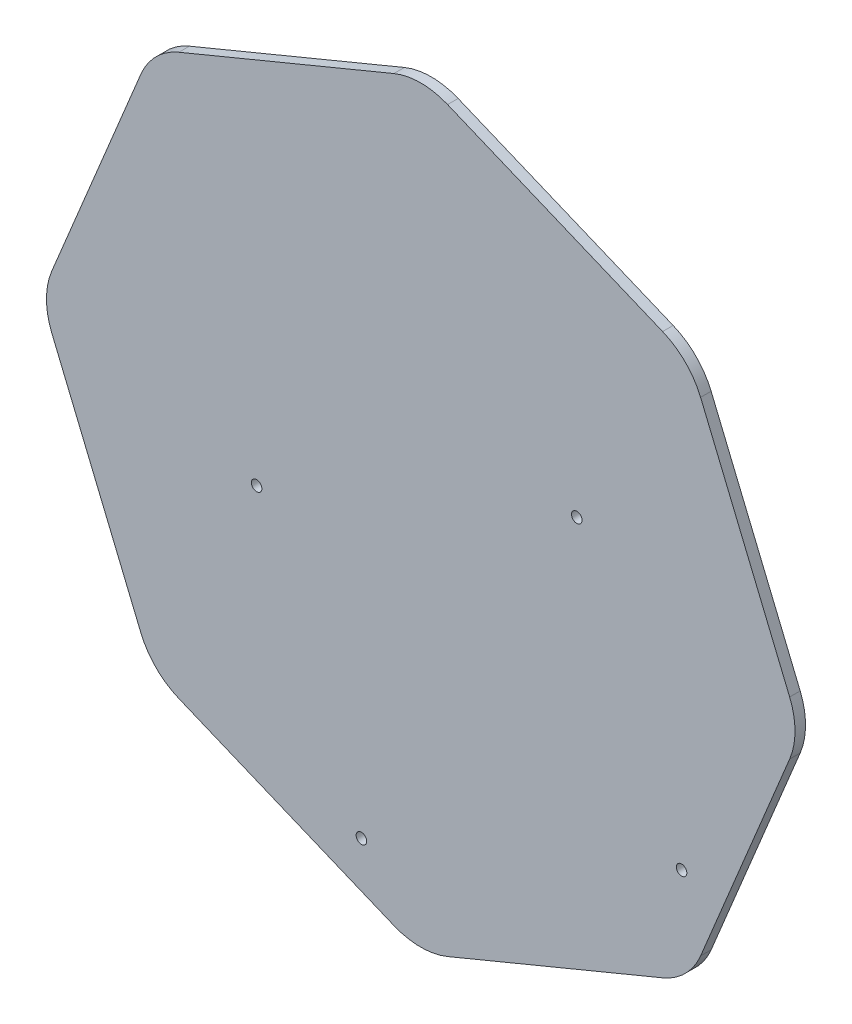
ISO-10303-21;
HEADER;
FILE_DESCRIPTION(('STEP AP214'),'2;1');
FILE_NAME('part.step','',(''),(''),'','','');
FILE_SCHEMA(('AUTOMOTIVE_DESIGN { 1 0 10303 214 1 1 1 1 }'));
ENDSEC;
DATA;
#1=APPLICATION_CONTEXT('core data for automotive mechanical design processes');
#2=APPLICATION_PROTOCOL_DEFINITION('international standard','automotive_design',2000,#1);
#3=PRODUCT_CONTEXT('',#1,'mechanical');
#4=PRODUCT('Part','Part','',(#3));
#5=PRODUCT_RELATED_PRODUCT_CATEGORY('part','',(#4));
#6=PRODUCT_DEFINITION_FORMATION('','',#4);
#7=PRODUCT_DEFINITION_CONTEXT('part definition',#1,'design');
#8=PRODUCT_DEFINITION('design','',#6,#7);
#9=PRODUCT_DEFINITION_SHAPE('','',#8);
#10=(LENGTH_UNIT() NAMED_UNIT(*) SI_UNIT(.MILLI.,.METRE.));
#11=(NAMED_UNIT(*) PLANE_ANGLE_UNIT() SI_UNIT($,.RADIAN.));
#12=(NAMED_UNIT(*) SI_UNIT($,.STERADIAN.) SOLID_ANGLE_UNIT());
#13=UNCERTAINTY_MEASURE_WITH_UNIT(LENGTH_MEASURE(1.E-05),#10,'distance_accuracy_value','');
#14=(GEOMETRIC_REPRESENTATION_CONTEXT(3) GLOBAL_UNCERTAINTY_ASSIGNED_CONTEXT((#13)) GLOBAL_UNIT_ASSIGNED_CONTEXT((#10,
#11,#12)) REPRESENTATION_CONTEXT('',''));
#15=CARTESIAN_POINT('',(0.,0.,0.));
#16=DIRECTION('',(0.,0.,1.));
#17=DIRECTION('',(1.,0.,0.));
#18=AXIS2_PLACEMENT_3D('',#15,#16,#17);
#19=CARTESIAN_POINT('',(0.,0.,3.));
#20=DIRECTION('',(0.,0.,1.));
#21=DIRECTION('',(1.,0.,0.));
#22=AXIS2_PLACEMENT_3D('',#19,#20,#21);
#23=PLANE('',#22);
#24=CARTESIAN_POINT('',(74.2947123568137,-50.4055375511293,3.));
#25=DIRECTION('',(0.,0.,1.));
#26=DIRECTION('',(1.,0.,0.));
#27=AXIS2_PLACEMENT_3D('',#24,#25,#26);
#28=CIRCLE('',#27,1.5);
#29=CARTESIAN_POINT('',(75.7947123568137,-50.4055375511293,3.));
#30=VERTEX_POINT('',#29);
#31=EDGE_CURVE('E598',#30,#30,#28,.T.);
#32=ORIENTED_EDGE('',*,*,#31,.F.);
#33=EDGE_LOOP('',(#32));
#34=FACE_BOUND('',#33,.T.);
#35=CARTESIAN_POINT('',(-46.7415052265273,-16.1137887896833,3.));
#36=DIRECTION('',(0.,0.,1.));
#37=DIRECTION('',(1.,0.,0.));
#38=AXIS2_PLACEMENT_3D('',#35,#36,#37);
#39=CIRCLE('',#38,1.5);
#40=CARTESIAN_POINT('',(-45.2415052265273,-16.1137887896833,3.));
#41=VERTEX_POINT('',#40);
#42=EDGE_CURVE('E332',#41,#41,#39,.T.);
#43=ORIENTED_EDGE('',*,*,#42,.F.);
#44=EDGE_LOOP('',(#43));
#45=FACE_BOUND('',#44,.T.);
#46=DIRECTION('',(-0.923879532511287,-0.38268343236509,0.));
#47=VECTOR('',#46,1.);
#48=CARTESIAN_POINT('',(0.,108.239220029239,3.));
#49=LINE('',#48,#47);
#50=CARTESIAN_POINT('',(-7.65366864730179,105.068966673617,3.));
#51=VERTEX_POINT('',#50);
#52=CARTESIAN_POINT('',(-68.8830178257162,79.7069398286401,3.));
#53=VERTEX_POINT('',#52);
#54=EDGE_CURVE('E353',#51,#53,#49,.T.);
#55=ORIENTED_EDGE('',*,*,#54,.T.);
#56=CARTESIAN_POINT('',(-61.2293491784144,61.2293491784144,3.));
#57=DIRECTION('',(0.,0.,1.));
#58=DIRECTION('',(1.,0.,0.));
#59=AXIS2_PLACEMENT_3D('',#56,#57,#58);
#60=CIRCLE('',#59,20.);
#61=CARTESIAN_POINT('',(-79.7069398286401,68.8830178257162,3.));
#62=VERTEX_POINT('',#61);
#63=EDGE_CURVE('E257',#53,#62,#60,.T.);
#64=ORIENTED_EDGE('',*,*,#63,.T.);
#65=DIRECTION('',(-0.38268343236509,-0.923879532511287,0.));
#66=VECTOR('',#65,1.);
#67=CARTESIAN_POINT('',(-76.536686473018,76.536686473018,3.));
#68=LINE('',#67,#66);
#69=CARTESIAN_POINT('',(-105.068966673617,7.65366864730183,3.));
#70=VERTEX_POINT('',#69);
#71=EDGE_CURVE('E174',#62,#70,#68,.T.);
#72=ORIENTED_EDGE('',*,*,#71,.T.);
#73=CARTESIAN_POINT('',(-86.5913760233915,0.,3.));
#74=DIRECTION('',(0.,0.,1.));
#75=DIRECTION('',(1.,0.,0.));
#76=AXIS2_PLACEMENT_3D('',#73,#74,#75);
#77=CIRCLE('',#76,20.);
#78=CARTESIAN_POINT('',(-105.068966673617,-7.65366864730185,3.));
#79=VERTEX_POINT('',#78);
#80=EDGE_CURVE('E237',#70,#79,#77,.T.);
#81=ORIENTED_EDGE('',*,*,#80,.T.);
#82=DIRECTION('',(0.382683432365095,-0.923879532511285,0.));
#83=VECTOR('',#82,1.);
#84=CARTESIAN_POINT('',(-108.239220029239,0.,3.));
#85=LINE('',#84,#83);
#86=CARTESIAN_POINT('',(-79.7069398286393,-68.8830178257171,3.));
#87=VERTEX_POINT('',#86);
#88=EDGE_CURVE('E301',#79,#87,#85,.T.);
#89=ORIENTED_EDGE('',*,*,#88,.T.);
#90=CARTESIAN_POINT('',(-61.2293491784136,-61.2293491784151,3.));
#91=DIRECTION('',(0.,0.,1.));
#92=DIRECTION('',(1.,0.,0.));
#93=AXIS2_PLACEMENT_3D('',#90,#91,#92);
#94=CIRCLE('',#93,20.);
#95=CARTESIAN_POINT('',(-68.8830178257152,-79.706939828641,3.));
#96=VERTEX_POINT('',#95);
#97=EDGE_CURVE('E240',#87,#96,#94,.T.);
#98=ORIENTED_EDGE('',*,*,#97,.T.);
#99=DIRECTION('',(0.923879532511291,-0.382683432365079,0.));
#100=VECTOR('',#99,1.);
#101=CARTESIAN_POINT('',(-76.5366864730171,-76.5366864730189,3.));
#102=LINE('',#101,#100);
#103=CARTESIAN_POINT('',(-7.65366864730058,-105.068966673617,3.));
#104=VERTEX_POINT('',#103);
#105=EDGE_CURVE('E314',#96,#104,#102,.T.);
#106=ORIENTED_EDGE('',*,*,#105,.T.);
#107=CARTESIAN_POINT('',(1.00787433954252E-12,-86.5913760233915,3.));
#108=DIRECTION('',(0.,0.,1.));
#109=DIRECTION('',(1.,0.,0.));
#110=AXIS2_PLACEMENT_3D('',#107,#108,#109);
#111=CIRCLE('',#110,20.);
#112=CARTESIAN_POINT('',(7.65366864730301,-105.068966673617,3.));
#113=VERTEX_POINT('',#112);
#114=EDGE_CURVE('E243',#104,#113,#111,.T.);
#115=ORIENTED_EDGE('',*,*,#114,.T.);
#116=DIRECTION('',(0.923879532511282,0.3826834323651,0.));
#117=VECTOR('',#116,1.);
#118=CARTESIAN_POINT('',(1.26199578248046E-12,-108.239220029239,3.));
#119=LINE('',#118,#117);
#120=CARTESIAN_POINT('',(68.8830178257172,-79.7069398286393,3.));
#121=VERTEX_POINT('',#120);
#122=EDGE_CURVE('E317',#113,#121,#119,.T.);
#123=ORIENTED_EDGE('',*,*,#122,.T.);
#124=CARTESIAN_POINT('',(61.2293491784152,-61.2293491784137,3.));
#125=DIRECTION('',(0.,0.,1.));
#126=DIRECTION('',(1.,0.,0.));
#127=AXIS2_PLACEMENT_3D('',#124,#125,#126);
#128=CIRCLE('',#127,20.);
#129=CARTESIAN_POINT('',(79.706939828641,-68.8830178257154,3.));
#130=VERTEX_POINT('',#129);
#131=EDGE_CURVE('E246',#121,#130,#128,.T.);
#132=ORIENTED_EDGE('',*,*,#131,.T.);
#133=DIRECTION('',(0.382683432365085,0.923879532511289,0.));
#134=VECTOR('',#133,1.);
#135=CARTESIAN_POINT('',(76.5366864730189,-76.5366864730171,3.));
#136=LINE('',#135,#134);
#137=CARTESIAN_POINT('',(105.068966673617,-7.65366864730174,3.));
#138=VERTEX_POINT('',#137);
#139=EDGE_CURVE('E322',#130,#138,#136,.T.);
#140=ORIENTED_EDGE('',*,*,#139,.T.);
#141=CARTESIAN_POINT('',(86.5913760233916,0.,3.));
#142=DIRECTION('',(0.,0.,1.));
#143=DIRECTION('',(1.,0.,0.));
#144=AXIS2_PLACEMENT_3D('',#141,#142,#143);
#145=CIRCLE('',#144,20.);
#146=CARTESIAN_POINT('',(105.068966673617,7.65366864730175,3.));
#147=VERTEX_POINT('',#146);
#148=EDGE_CURVE('E61',#138,#147,#145,.T.);
#149=ORIENTED_EDGE('',*,*,#148,.T.);
#150=DIRECTION('',(-0.38268343236509,0.923879532511287,0.));
#151=VECTOR('',#150,1.);
#152=CARTESIAN_POINT('',(108.239220029239,0.,3.));
#153=LINE('',#152,#151);
#154=CARTESIAN_POINT('',(79.7069398286401,68.8830178257162,3.));
#155=VERTEX_POINT('',#154);
#156=EDGE_CURVE('E211',#147,#155,#153,.T.);
#157=ORIENTED_EDGE('',*,*,#156,.T.);
#158=CARTESIAN_POINT('',(61.2293491784144,61.2293491784144,3.));
#159=DIRECTION('',(0.,0.,1.));
#160=DIRECTION('',(1.,0.,0.));
#161=AXIS2_PLACEMENT_3D('',#158,#159,#160);
#162=CIRCLE('',#161,20.);
#163=CARTESIAN_POINT('',(68.8830178257162,79.7069398286401,3.));
#164=VERTEX_POINT('',#163);
#165=EDGE_CURVE('E251',#155,#164,#162,.T.);
#166=ORIENTED_EDGE('',*,*,#165,.T.);
#167=DIRECTION('',(-0.923879532511287,0.38268343236509,0.));
#168=VECTOR('',#167,1.);
#169=CARTESIAN_POINT('',(76.536686473018,76.536686473018,3.));
#170=LINE('',#169,#168);
#171=CARTESIAN_POINT('',(7.6536686473018,105.068966673617,3.));
#172=VERTEX_POINT('',#171);
#173=EDGE_CURVE('E209',#164,#172,#170,.T.);
#174=ORIENTED_EDGE('',*,*,#173,.T.);
#175=CARTESIAN_POINT('',(0.,86.5913760233915,3.));
#176=DIRECTION('',(0.,0.,1.));
#177=DIRECTION('',(1.,0.,0.));
#178=AXIS2_PLACEMENT_3D('',#175,#176,#177);
#179=CIRCLE('',#178,20.);
#180=EDGE_CURVE('E254',#172,#51,#179,.T.);
#181=ORIENTED_EDGE('',*,*,#180,.T.);
#182=EDGE_LOOP('',(#55,#64,#72,#81,#89,#98,#106,#115,#123,#132,#140,#149,#157,#166,#174,#181));
#183=FACE_BOUND('',#182,.T.);
#184=CARTESIAN_POINT('',(-16.8921975020503,-88.1763923255637,3.));
#185=DIRECTION('',(0.,0.,1.));
#186=DIRECTION('',(1.,0.,0.));
#187=AXIS2_PLACEMENT_3D('',#184,#185,#186);
#188=CIRCLE('',#187,1.5);
#189=CARTESIAN_POINT('',(-15.3921975020503,-88.1763923255637,3.));
#190=VERTEX_POINT('',#189);
#191=EDGE_CURVE('E344',#190,#190,#188,.T.);
#192=ORIENTED_EDGE('',*,*,#191,.F.);
#193=EDGE_LOOP('',(#192));
#194=FACE_BOUND('',#193,.T.);
#195=CARTESIAN_POINT('',(44.4454046323367,21.657065984751,3.));
#196=DIRECTION('',(0.,0.,1.));
#197=DIRECTION('',(1.,0.,0.));
#198=AXIS2_PLACEMENT_3D('',#195,#196,#197);
#199=CIRCLE('',#198,1.5);
#200=CARTESIAN_POINT('',(45.9454046323367,21.657065984751,3.));
#201=VERTEX_POINT('',#200);
#202=EDGE_CURVE('E592',#201,#201,#199,.T.);
#203=ORIENTED_EDGE('',*,*,#202,.F.);
#204=EDGE_LOOP('',(#203));
#205=FACE_BOUND('',#204,.T.);
#206=ADVANCED_FACE('F38',(#34,#45,#183,#194,#205),#23,.T.);
#207=CARTESIAN_POINT('',(0.,0.,0.));
#208=DIRECTION('',(0.,0.,1.));
#209=DIRECTION('',(1.,0.,0.));
#210=AXIS2_PLACEMENT_3D('',#207,#208,#209);
#211=PLANE('',#210);
#212=DIRECTION('',(-0.38268343236509,-0.923879532511287,0.));
#213=VECTOR('',#212,1.);
#214=CARTESIAN_POINT('',(-76.536686473018,76.536686473018,0.));
#215=LINE('',#214,#213);
#216=CARTESIAN_POINT('',(-79.7069398286401,68.8830178257162,0.));
#217=VERTEX_POINT('',#216);
#218=CARTESIAN_POINT('',(-105.068966673617,7.65366864730183,0.));
#219=VERTEX_POINT('',#218);
#220=EDGE_CURVE('E171',#217,#219,#215,.T.);
#221=ORIENTED_EDGE('',*,*,#220,.F.);
#222=CARTESIAN_POINT('',(-61.2293491784144,61.2293491784144,0.));
#223=DIRECTION('',(0.,0.,1.));
#224=DIRECTION('',(1.,0.,0.));
#225=AXIS2_PLACEMENT_3D('',#222,#223,#224);
#226=CIRCLE('',#225,20.);
#227=CARTESIAN_POINT('',(-68.8830178257162,79.7069398286401,0.));
#228=VERTEX_POINT('',#227);
#229=EDGE_CURVE('E153',#217,#228,#226,.F.);
#230=ORIENTED_EDGE('',*,*,#229,.T.);
#231=DIRECTION('',(-0.923879532511287,-0.38268343236509,0.));
#232=VECTOR('',#231,1.);
#233=CARTESIAN_POINT('',(0.,108.239220029239,0.));
#234=LINE('',#233,#232);
#235=CARTESIAN_POINT('',(-7.65366864730179,105.068966673617,0.));
#236=VERTEX_POINT('',#235);
#237=EDGE_CURVE('E184',#236,#228,#234,.T.);
#238=ORIENTED_EDGE('',*,*,#237,.F.);
#239=CARTESIAN_POINT('',(0.,86.5913760233915,0.));
#240=DIRECTION('',(0.,0.,1.));
#241=DIRECTION('',(1.,0.,0.));
#242=AXIS2_PLACEMENT_3D('',#239,#240,#241);
#243=CIRCLE('',#242,20.);
#244=CARTESIAN_POINT('',(7.6536686473018,105.068966673617,0.));
#245=VERTEX_POINT('',#244);
#246=EDGE_CURVE('E165',#236,#245,#243,.F.);
#247=ORIENTED_EDGE('',*,*,#246,.T.);
#248=DIRECTION('',(-0.923879532511287,0.38268343236509,0.));
#249=VECTOR('',#248,1.);
#250=CARTESIAN_POINT('',(76.536686473018,76.536686473018,0.));
#251=LINE('',#250,#249);
#252=CARTESIAN_POINT('',(68.8830178257162,79.7069398286401,0.));
#253=VERTEX_POINT('',#252);
#254=EDGE_CURVE('E191',#253,#245,#251,.T.);
#255=ORIENTED_EDGE('',*,*,#254,.F.);
#256=CARTESIAN_POINT('',(61.2293491784144,61.2293491784144,0.));
#257=DIRECTION('',(0.,0.,1.));
#258=DIRECTION('',(1.,0.,0.));
#259=AXIS2_PLACEMENT_3D('',#256,#257,#258);
#260=CIRCLE('',#259,20.);
#261=CARTESIAN_POINT('',(79.7069398286401,68.8830178257162,0.));
#262=VERTEX_POINT('',#261);
#263=EDGE_CURVE('E227',#253,#262,#260,.F.);
#264=ORIENTED_EDGE('',*,*,#263,.T.);
#265=DIRECTION('',(-0.38268343236509,0.923879532511287,0.));
#266=VECTOR('',#265,1.);
#267=CARTESIAN_POINT('',(108.239220029239,0.,0.));
#268=LINE('',#267,#266);
#269=CARTESIAN_POINT('',(105.068966673617,7.65366864730175,0.));
#270=VERTEX_POINT('',#269);
#271=EDGE_CURVE('E206',#270,#262,#268,.T.);
#272=ORIENTED_EDGE('',*,*,#271,.F.);
#273=CARTESIAN_POINT('',(86.5913760233916,0.,0.));
#274=DIRECTION('',(0.,0.,1.));
#275=DIRECTION('',(1.,0.,0.));
#276=AXIS2_PLACEMENT_3D('',#273,#274,#275);
#277=CIRCLE('',#276,20.);
#278=CARTESIAN_POINT('',(105.068966673617,-7.65366864730174,0.));
#279=VERTEX_POINT('',#278);
#280=EDGE_CURVE('E224',#270,#279,#277,.F.);
#281=ORIENTED_EDGE('',*,*,#280,.T.);
#282=DIRECTION('',(0.382683432365085,0.923879532511289,0.));
#283=VECTOR('',#282,1.);
#284=CARTESIAN_POINT('',(76.5366864730189,-76.5366864730171,0.));
#285=LINE('',#284,#283);
#286=CARTESIAN_POINT('',(79.706939828641,-68.8830178257154,0.));
#287=VERTEX_POINT('',#286);
#288=EDGE_CURVE('E202',#287,#279,#285,.T.);
#289=ORIENTED_EDGE('',*,*,#288,.F.);
#290=CARTESIAN_POINT('',(61.2293491784152,-61.2293491784137,0.));
#291=DIRECTION('',(0.,0.,1.));
#292=DIRECTION('',(1.,0.,0.));
#293=AXIS2_PLACEMENT_3D('',#290,#291,#292);
#294=CIRCLE('',#293,20.);
#295=CARTESIAN_POINT('',(68.8830178257172,-79.7069398286393,0.));
#296=VERTEX_POINT('',#295);
#297=EDGE_CURVE('E221',#287,#296,#294,.F.);
#298=ORIENTED_EDGE('',*,*,#297,.T.);
#299=DIRECTION('',(0.923879532511282,0.3826834323651,0.));
#300=VECTOR('',#299,1.);
#301=CARTESIAN_POINT('',(1.26199578248046E-12,-108.239220029239,0.));
#302=LINE('',#301,#300);
#303=CARTESIAN_POINT('',(7.65366864730301,-105.068966673617,0.));
#304=VERTEX_POINT('',#303);
#305=EDGE_CURVE('E198',#304,#296,#302,.T.);
#306=ORIENTED_EDGE('',*,*,#305,.F.);
#307=CARTESIAN_POINT('',(1.00787433954252E-12,-86.5913760233915,0.));
#308=DIRECTION('',(0.,0.,1.));
#309=DIRECTION('',(1.,0.,0.));
#310=AXIS2_PLACEMENT_3D('',#307,#308,#309);
#311=CIRCLE('',#310,20.);
#312=CARTESIAN_POINT('',(-7.65366864730058,-105.068966673617,0.));
#313=VERTEX_POINT('',#312);
#314=EDGE_CURVE('E218',#304,#313,#311,.F.);
#315=ORIENTED_EDGE('',*,*,#314,.T.);
#316=DIRECTION('',(0.923879532511291,-0.382683432365079,0.));
#317=VECTOR('',#316,1.);
#318=CARTESIAN_POINT('',(-76.5366864730171,-76.5366864730189,0.));
#319=LINE('',#318,#317);
#320=CARTESIAN_POINT('',(-68.8830178257152,-79.706939828641,0.));
#321=VERTEX_POINT('',#320);
#322=EDGE_CURVE('E189',#321,#313,#319,.T.);
#323=ORIENTED_EDGE('',*,*,#322,.F.);
#324=CARTESIAN_POINT('',(-61.2293491784136,-61.2293491784151,0.));
#325=DIRECTION('',(0.,0.,1.));
#326=DIRECTION('',(1.,0.,0.));
#327=AXIS2_PLACEMENT_3D('',#324,#325,#326);
#328=CIRCLE('',#327,20.);
#329=CARTESIAN_POINT('',(-79.7069398286393,-68.8830178257171,0.));
#330=VERTEX_POINT('',#329);
#331=EDGE_CURVE('E215',#321,#330,#328,.F.);
#332=ORIENTED_EDGE('',*,*,#331,.T.);
#333=DIRECTION('',(0.382683432365095,-0.923879532511285,0.));
#334=VECTOR('',#333,1.);
#335=CARTESIAN_POINT('',(-108.239220029239,0.,0.));
#336=LINE('',#335,#334);
#337=CARTESIAN_POINT('',(-105.068966673617,-7.65366864730185,0.));
#338=VERTEX_POINT('',#337);
#339=EDGE_CURVE('E183',#338,#330,#336,.T.);
#340=ORIENTED_EDGE('',*,*,#339,.F.);
#341=CARTESIAN_POINT('',(-86.5913760233915,0.,0.));
#342=DIRECTION('',(0.,0.,1.));
#343=DIRECTION('',(1.,0.,0.));
#344=AXIS2_PLACEMENT_3D('',#341,#342,#343);
#345=CIRCLE('',#344,20.);
#346=EDGE_CURVE('E176',#338,#219,#345,.F.);
#347=ORIENTED_EDGE('',*,*,#346,.T.);
#348=EDGE_LOOP('',(#221,#230,#238,#247,#255,#264,#272,#281,#289,#298,#306,#315,#323,#332,#340,#347));
#349=FACE_BOUND('',#348,.T.);
#350=CARTESIAN_POINT('',(-46.7415052265273,-16.1137887896833,0.));
#351=DIRECTION('',(0.,0.,1.));
#352=DIRECTION('',(1.,0.,0.));
#353=AXIS2_PLACEMENT_3D('',#350,#351,#352);
#354=CIRCLE('',#353,1.5);
#355=CARTESIAN_POINT('',(-45.2415052265273,-16.1137887896833,0.));
#356=VERTEX_POINT('',#355);
#357=EDGE_CURVE('E338',#356,#356,#354,.T.);
#358=ORIENTED_EDGE('',*,*,#357,.T.);
#359=EDGE_LOOP('',(#358));
#360=FACE_BOUND('',#359,.T.);
#361=CARTESIAN_POINT('',(-16.8921975020503,-88.1763923255637,0.));
#362=DIRECTION('',(0.,0.,1.));
#363=DIRECTION('',(1.,0.,0.));
#364=AXIS2_PLACEMENT_3D('',#361,#362,#363);
#365=CIRCLE('',#364,1.5);
#366=CARTESIAN_POINT('',(-15.3921975020503,-88.1763923255637,0.));
#367=VERTEX_POINT('',#366);
#368=EDGE_CURVE('E347',#367,#367,#365,.T.);
#369=ORIENTED_EDGE('',*,*,#368,.T.);
#370=EDGE_LOOP('',(#369));
#371=FACE_BOUND('',#370,.T.);
#372=CARTESIAN_POINT('',(74.2947123568137,-50.4055375511293,0.));
#373=DIRECTION('',(0.,0.,1.));
#374=DIRECTION('',(1.,0.,0.));
#375=AXIS2_PLACEMENT_3D('',#372,#373,#374);
#376=CIRCLE('',#375,1.5);
#377=CARTESIAN_POINT('',(75.7947123568137,-50.4055375511293,0.));
#378=VERTEX_POINT('',#377);
#379=EDGE_CURVE('E586',#378,#378,#376,.T.);
#380=ORIENTED_EDGE('',*,*,#379,.T.);
#381=EDGE_LOOP('',(#380));
#382=FACE_BOUND('',#381,.T.);
#383=CARTESIAN_POINT('',(44.4454046323367,21.657065984751,0.));
#384=DIRECTION('',(0.,0.,1.));
#385=DIRECTION('',(1.,0.,0.));
#386=AXIS2_PLACEMENT_3D('',#383,#384,#385);
#387=CIRCLE('',#386,1.5);
#388=CARTESIAN_POINT('',(45.9454046323367,21.657065984751,0.));
#389=VERTEX_POINT('',#388);
#390=EDGE_CURVE('E589',#389,#389,#387,.T.);
#391=ORIENTED_EDGE('',*,*,#390,.T.);
#392=EDGE_LOOP('',(#391));
#393=FACE_BOUND('',#392,.T.);
#394=ADVANCED_FACE('F179',(#349,#360,#371,#382,#393),#211,.F.);
#395=CARTESIAN_POINT('',(76.536686473018,76.536686473018,3.));
#396=DIRECTION('',(-0.38268343236509,-0.923879532511287,0.));
#397=DIRECTION('',(0.923879532511287,-0.38268343236509,0.));
#398=AXIS2_PLACEMENT_3D('',#395,#396,#397);
#399=PLANE('',#398);
#400=ORIENTED_EDGE('',*,*,#254,.T.);
#401=DIRECTION('',(0.,0.,-1.));
#402=VECTOR('',#401,1.);
#403=CARTESIAN_POINT('',(7.6536686473018,105.068966673617,3.));
#404=LINE('',#403,#402);
#405=EDGE_CURVE('E264',#245,#172,#404,.F.);
#406=ORIENTED_EDGE('',*,*,#405,.T.);
#407=ORIENTED_EDGE('',*,*,#173,.F.);
#408=DIRECTION('',(0.,0.,-1.));
#409=VECTOR('',#408,1.);
#410=CARTESIAN_POINT('',(68.8830178257162,79.7069398286401,3.));
#411=LINE('',#410,#409);
#412=EDGE_CURVE('E260',#164,#253,#411,.T.);
#413=ORIENTED_EDGE('',*,*,#412,.T.);
#414=EDGE_LOOP('',(#400,#406,#407,#413));
#415=FACE_BOUND('',#414,.T.);
#416=ADVANCED_FACE('F370',(#415),#399,.F.);
#417=CARTESIAN_POINT('',(0.,108.239220029239,3.));
#418=DIRECTION('',(0.38268343236509,-0.923879532511287,0.));
#419=DIRECTION('',(0.923879532511287,0.38268343236509,0.));
#420=AXIS2_PLACEMENT_3D('',#417,#418,#419);
#421=PLANE('',#420);
#422=ORIENTED_EDGE('',*,*,#237,.T.);
#423=DIRECTION('',(0.,0.,-1.));
#424=VECTOR('',#423,1.);
#425=CARTESIAN_POINT('',(-68.8830178257162,79.7069398286401,3.));
#426=LINE('',#425,#424);
#427=EDGE_CURVE('E158',#228,#53,#426,.F.);
#428=ORIENTED_EDGE('',*,*,#427,.T.);
#429=ORIENTED_EDGE('',*,*,#54,.F.);
#430=DIRECTION('',(0.,0.,-1.));
#431=VECTOR('',#430,1.);
#432=CARTESIAN_POINT('',(-7.65366864730179,105.068966673617,3.));
#433=LINE('',#432,#431);
#434=EDGE_CURVE('E164',#51,#236,#433,.T.);
#435=ORIENTED_EDGE('',*,*,#434,.T.);
#436=EDGE_LOOP('',(#422,#428,#429,#435));
#437=FACE_BOUND('',#436,.T.);
#438=ADVANCED_FACE('F395',(#437),#421,.F.);
#439=CARTESIAN_POINT('',(-76.536686473018,76.536686473018,3.));
#440=DIRECTION('',(0.923879532511287,-0.38268343236509,0.));
#441=DIRECTION('',(0.38268343236509,0.923879532511287,0.));
#442=AXIS2_PLACEMENT_3D('',#439,#440,#441);
#443=PLANE('',#442);
#444=ORIENTED_EDGE('',*,*,#71,.F.);
#445=DIRECTION('',(0.,0.,-1.));
#446=VECTOR('',#445,1.);
#447=CARTESIAN_POINT('',(-79.7069398286401,68.8830178257162,3.));
#448=LINE('',#447,#446);
#449=EDGE_CURVE('E157',#62,#217,#448,.T.);
#450=ORIENTED_EDGE('',*,*,#449,.T.);
#451=ORIENTED_EDGE('',*,*,#220,.T.);
#452=DIRECTION('',(0.,0.,-1.));
#453=VECTOR('',#452,1.);
#454=CARTESIAN_POINT('',(-105.068966673617,7.65366864730185,3.));
#455=LINE('',#454,#453);
#456=EDGE_CURVE('E177',#219,#70,#455,.F.);
#457=ORIENTED_EDGE('',*,*,#456,.T.);
#458=EDGE_LOOP('',(#444,#450,#451,#457));
#459=FACE_BOUND('',#458,.T.);
#460=ADVANCED_FACE('F170',(#459),#443,.F.);
#461=CARTESIAN_POINT('',(-108.239220029239,0.,3.));
#462=DIRECTION('',(0.923879532511284,0.382683432365095,0.));
#463=DIRECTION('',(-0.382683432365095,0.923879532511285,0.));
#464=AXIS2_PLACEMENT_3D('',#461,#462,#463);
#465=PLANE('',#464);
#466=ORIENTED_EDGE('',*,*,#339,.T.);
#467=DIRECTION('',(0.,0.,-1.));
#468=VECTOR('',#467,1.);
#469=CARTESIAN_POINT('',(-79.7069398286393,-68.883017825717,3.));
#470=LINE('',#469,#468);
#471=EDGE_CURVE('E11',#330,#87,#470,.F.);
#472=ORIENTED_EDGE('',*,*,#471,.T.);
#473=ORIENTED_EDGE('',*,*,#88,.F.);
#474=DIRECTION('',(0.,0.,-1.));
#475=VECTOR('',#474,1.);
#476=CARTESIAN_POINT('',(-105.068966673617,-7.65366864730186,3.));
#477=LINE('',#476,#475);
#478=EDGE_CURVE('E47',#79,#338,#477,.T.);
#479=ORIENTED_EDGE('',*,*,#478,.T.);
#480=EDGE_LOOP('',(#466,#472,#473,#479));
#481=FACE_BOUND('',#480,.T.);
#482=ADVANCED_FACE('F298',(#481),#465,.F.);
#483=CARTESIAN_POINT('',(-76.5366864730171,-76.5366864730189,3.));
#484=DIRECTION('',(0.382683432365079,0.923879532511291,0.));
#485=DIRECTION('',(-0.923879532511291,0.382683432365079,0.));
#486=AXIS2_PLACEMENT_3D('',#483,#484,#485);
#487=PLANE('',#486);
#488=ORIENTED_EDGE('',*,*,#322,.T.);
#489=DIRECTION('',(0.,0.,-1.));
#490=VECTOR('',#489,1.);
#491=CARTESIAN_POINT('',(-7.65366864730056,-105.068966673617,3.));
#492=LINE('',#491,#490);
#493=EDGE_CURVE('E291',#313,#104,#492,.F.);
#494=ORIENTED_EDGE('',*,*,#493,.T.);
#495=ORIENTED_EDGE('',*,*,#105,.F.);
#496=DIRECTION('',(0.,0.,-1.));
#497=VECTOR('',#496,1.);
#498=CARTESIAN_POINT('',(-68.8830178257152,-79.706939828641,3.));
#499=LINE('',#498,#497);
#500=EDGE_CURVE('E287',#96,#321,#499,.T.);
#501=ORIENTED_EDGE('',*,*,#500,.T.);
#502=EDGE_LOOP('',(#488,#494,#495,#501));
#503=FACE_BOUND('',#502,.T.);
#504=ADVANCED_FACE('F311',(#503),#487,.F.);
#505=CARTESIAN_POINT('',(1.26199578248046E-12,-108.239220029239,3.));
#506=DIRECTION('',(-0.3826834323651,0.923879532511282,0.));
#507=DIRECTION('',(-0.923879532511283,-0.3826834323651,0.));
#508=AXIS2_PLACEMENT_3D('',#505,#506,#507);
#509=PLANE('',#508);
#510=ORIENTED_EDGE('',*,*,#305,.T.);
#511=DIRECTION('',(0.,0.,-1.));
#512=VECTOR('',#511,1.);
#513=CARTESIAN_POINT('',(68.8830178257172,-79.7069398286393,3.));
#514=LINE('',#513,#512);
#515=EDGE_CURVE('E284',#296,#121,#514,.F.);
#516=ORIENTED_EDGE('',*,*,#515,.T.);
#517=ORIENTED_EDGE('',*,*,#122,.F.);
#518=DIRECTION('',(0.,0.,-1.));
#519=VECTOR('',#518,1.);
#520=CARTESIAN_POINT('',(7.65366864730301,-105.068966673617,3.));
#521=LINE('',#520,#519);
#522=EDGE_CURVE('E280',#113,#304,#521,.T.);
#523=ORIENTED_EDGE('',*,*,#522,.T.);
#524=EDGE_LOOP('',(#510,#516,#517,#523));
#525=FACE_BOUND('',#524,.T.);
#526=ADVANCED_FACE('F384',(#525),#509,.F.);
#527=CARTESIAN_POINT('',(76.5366864730189,-76.5366864730171,3.));
#528=DIRECTION('',(-0.923879532511289,0.382683432365085,0.));
#529=DIRECTION('',(-0.382683432365085,-0.923879532511289,0.));
#530=AXIS2_PLACEMENT_3D('',#527,#528,#529);
#531=PLANE('',#530);
#532=ORIENTED_EDGE('',*,*,#288,.T.);
#533=DIRECTION('',(0.,0.,-1.));
#534=VECTOR('',#533,1.);
#535=CARTESIAN_POINT('',(105.068966673617,-7.65366864730174,3.));
#536=LINE('',#535,#534);
#537=EDGE_CURVE('E277',#279,#138,#536,.F.);
#538=ORIENTED_EDGE('',*,*,#537,.T.);
#539=ORIENTED_EDGE('',*,*,#139,.F.);
#540=DIRECTION('',(0.,0.,-1.));
#541=VECTOR('',#540,1.);
#542=CARTESIAN_POINT('',(79.706939828641,-68.8830178257154,3.));
#543=LINE('',#542,#541);
#544=EDGE_CURVE('E273',#130,#287,#543,.T.);
#545=ORIENTED_EDGE('',*,*,#544,.T.);
#546=EDGE_LOOP('',(#532,#538,#539,#545));
#547=FACE_BOUND('',#546,.T.);
#548=ADVANCED_FACE('F381',(#547),#531,.F.);
#549=CARTESIAN_POINT('',(108.239220029239,0.,3.));
#550=DIRECTION('',(-0.923879532511286,-0.38268343236509,0.));
#551=DIRECTION('',(0.38268343236509,-0.923879532511287,0.));
#552=AXIS2_PLACEMENT_3D('',#549,#550,#551);
#553=PLANE('',#552);
#554=ORIENTED_EDGE('',*,*,#271,.T.);
#555=DIRECTION('',(0.,0.,-1.));
#556=VECTOR('',#555,1.);
#557=CARTESIAN_POINT('',(79.7069398286401,68.8830178257162,3.));
#558=LINE('',#557,#556);
#559=EDGE_CURVE('E54',#262,#155,#558,.F.);
#560=ORIENTED_EDGE('',*,*,#559,.T.);
#561=ORIENTED_EDGE('',*,*,#156,.F.);
#562=DIRECTION('',(0.,0.,-1.));
#563=VECTOR('',#562,1.);
#564=CARTESIAN_POINT('',(105.068966673617,7.65366864730175,3.));
#565=LINE('',#564,#563);
#566=EDGE_CURVE('E267',#147,#270,#565,.T.);
#567=ORIENTED_EDGE('',*,*,#566,.T.);
#568=EDGE_LOOP('',(#554,#560,#561,#567));
#569=FACE_BOUND('',#568,.T.);
#570=ADVANCED_FACE('F378',(#569),#553,.F.);
#571=CARTESIAN_POINT('',(-46.7415052265273,-16.1137887896833,3.));
#572=DIRECTION('',(0.,0.,-1.));
#573=DIRECTION('',(-1.,0.,0.));
#574=AXIS2_PLACEMENT_3D('',#571,#572,#573);
#575=CYLINDRICAL_SURFACE('',#574,1.5);
#576=ORIENTED_EDGE('',*,*,#42,.T.);
#577=EDGE_LOOP('',(#576));
#578=FACE_BOUND('',#577,.T.);
#579=ORIENTED_EDGE('',*,*,#357,.F.);
#580=EDGE_LOOP('',(#579));
#581=FACE_BOUND('',#580,.T.);
#582=ADVANCED_FACE('F375',(#578,#581),#575,.F.);
#583=CARTESIAN_POINT('',(-16.8921975020503,-88.1763923255637,3.));
#584=DIRECTION('',(0.,0.,-1.));
#585=DIRECTION('',(-1.,0.,0.));
#586=AXIS2_PLACEMENT_3D('',#583,#584,#585);
#587=CYLINDRICAL_SURFACE('',#586,1.5);
#588=ORIENTED_EDGE('',*,*,#191,.T.);
#589=EDGE_LOOP('',(#588));
#590=FACE_BOUND('',#589,.T.);
#591=ORIENTED_EDGE('',*,*,#368,.F.);
#592=EDGE_LOOP('',(#591));
#593=FACE_BOUND('',#592,.T.);
#594=ADVANCED_FACE('F495',(#590,#593),#587,.F.);
#595=CARTESIAN_POINT('',(74.2947123568137,-50.4055375511293,3.));
#596=DIRECTION('',(0.,0.,-1.));
#597=DIRECTION('',(-1.,0.,0.));
#598=AXIS2_PLACEMENT_3D('',#595,#596,#597);
#599=CYLINDRICAL_SURFACE('',#598,1.5);
#600=ORIENTED_EDGE('',*,*,#31,.T.);
#601=EDGE_LOOP('',(#600));
#602=FACE_BOUND('',#601,.T.);
#603=ORIENTED_EDGE('',*,*,#379,.F.);
#604=EDGE_LOOP('',(#603));
#605=FACE_BOUND('',#604,.T.);
#606=ADVANCED_FACE('F486',(#602,#605),#599,.F.);
#607=CARTESIAN_POINT('',(44.4454046323367,21.657065984751,3.));
#608=DIRECTION('',(0.,0.,-1.));
#609=DIRECTION('',(-1.,0.,0.));
#610=AXIS2_PLACEMENT_3D('',#607,#608,#609);
#611=CYLINDRICAL_SURFACE('',#610,1.5);
#612=ORIENTED_EDGE('',*,*,#202,.T.);
#613=EDGE_LOOP('',(#612));
#614=FACE_BOUND('',#613,.T.);
#615=ORIENTED_EDGE('',*,*,#390,.F.);
#616=EDGE_LOOP('',(#615));
#617=FACE_BOUND('',#616,.T.);
#618=ADVANCED_FACE('F404',(#614,#617),#611,.F.);
#619=CARTESIAN_POINT('',(-61.2293491784144,61.2293491784144,3.));
#620=DIRECTION('',(0.,0.,-1.));
#621=DIRECTION('',(-1.,0.,0.));
#622=AXIS2_PLACEMENT_3D('',#619,#620,#621);
#623=CYLINDRICAL_SURFACE('',#622,20.);
#624=ORIENTED_EDGE('',*,*,#63,.F.);
#625=ORIENTED_EDGE('',*,*,#427,.F.);
#626=ORIENTED_EDGE('',*,*,#229,.F.);
#627=ORIENTED_EDGE('',*,*,#449,.F.);
#628=EDGE_LOOP('',(#624,#625,#626,#627));
#629=FACE_BOUND('',#628,.T.);
#630=ADVANCED_FACE('F156',(#629),#623,.T.);
#631=CARTESIAN_POINT('',(0.,86.5913760233915,3.));
#632=DIRECTION('',(0.,0.,-1.));
#633=DIRECTION('',(-1.,0.,0.));
#634=AXIS2_PLACEMENT_3D('',#631,#632,#633);
#635=CYLINDRICAL_SURFACE('',#634,20.);
#636=ORIENTED_EDGE('',*,*,#180,.F.);
#637=ORIENTED_EDGE('',*,*,#405,.F.);
#638=ORIENTED_EDGE('',*,*,#246,.F.);
#639=ORIENTED_EDGE('',*,*,#434,.F.);
#640=EDGE_LOOP('',(#636,#637,#638,#639));
#641=FACE_BOUND('',#640,.T.);
#642=ADVANCED_FACE('F403',(#641),#635,.T.);
#643=CARTESIAN_POINT('',(61.2293491784144,61.2293491784144,3.));
#644=DIRECTION('',(0.,0.,-1.));
#645=DIRECTION('',(-1.,0.,0.));
#646=AXIS2_PLACEMENT_3D('',#643,#644,#645);
#647=CYLINDRICAL_SURFACE('',#646,20.);
#648=ORIENTED_EDGE('',*,*,#165,.F.);
#649=ORIENTED_EDGE('',*,*,#559,.F.);
#650=ORIENTED_EDGE('',*,*,#263,.F.);
#651=ORIENTED_EDGE('',*,*,#412,.F.);
#652=EDGE_LOOP('',(#648,#649,#650,#651));
#653=FACE_BOUND('',#652,.T.);
#654=ADVANCED_FACE('F407',(#653),#647,.T.);
#655=CARTESIAN_POINT('',(86.5913760233916,0.,3.));
#656=DIRECTION('',(0.,0.,-1.));
#657=DIRECTION('',(-1.,0.,0.));
#658=AXIS2_PLACEMENT_3D('',#655,#656,#657);
#659=CYLINDRICAL_SURFACE('',#658,20.);
#660=ORIENTED_EDGE('',*,*,#148,.F.);
#661=ORIENTED_EDGE('',*,*,#537,.F.);
#662=ORIENTED_EDGE('',*,*,#280,.F.);
#663=ORIENTED_EDGE('',*,*,#566,.F.);
#664=EDGE_LOOP('',(#660,#661,#662,#663));
#665=FACE_BOUND('',#664,.T.);
#666=ADVANCED_FACE('F411',(#665),#659,.T.);
#667=CARTESIAN_POINT('',(61.2293491784152,-61.2293491784137,3.));
#668=DIRECTION('',(0.,0.,-1.));
#669=DIRECTION('',(-1.,0.,0.));
#670=AXIS2_PLACEMENT_3D('',#667,#668,#669);
#671=CYLINDRICAL_SURFACE('',#670,20.);
#672=ORIENTED_EDGE('',*,*,#131,.F.);
#673=ORIENTED_EDGE('',*,*,#515,.F.);
#674=ORIENTED_EDGE('',*,*,#297,.F.);
#675=ORIENTED_EDGE('',*,*,#544,.F.);
#676=EDGE_LOOP('',(#672,#673,#674,#675));
#677=FACE_BOUND('',#676,.T.);
#678=ADVANCED_FACE('F415',(#677),#671,.T.);
#679=CARTESIAN_POINT('',(1.00787433954252E-12,-86.5913760233915,3.));
#680=DIRECTION('',(0.,0.,-1.));
#681=DIRECTION('',(-1.,0.,0.));
#682=AXIS2_PLACEMENT_3D('',#679,#680,#681);
#683=CYLINDRICAL_SURFACE('',#682,20.);
#684=ORIENTED_EDGE('',*,*,#114,.F.);
#685=ORIENTED_EDGE('',*,*,#493,.F.);
#686=ORIENTED_EDGE('',*,*,#314,.F.);
#687=ORIENTED_EDGE('',*,*,#522,.F.);
#688=EDGE_LOOP('',(#684,#685,#686,#687));
#689=FACE_BOUND('',#688,.T.);
#690=ADVANCED_FACE('F362',(#689),#683,.T.);
#691=CARTESIAN_POINT('',(-61.2293491784136,-61.2293491784151,3.));
#692=DIRECTION('',(0.,0.,-1.));
#693=DIRECTION('',(-1.,0.,0.));
#694=AXIS2_PLACEMENT_3D('',#691,#692,#693);
#695=CYLINDRICAL_SURFACE('',#694,20.);
#696=ORIENTED_EDGE('',*,*,#97,.F.);
#697=ORIENTED_EDGE('',*,*,#471,.F.);
#698=ORIENTED_EDGE('',*,*,#331,.F.);
#699=ORIENTED_EDGE('',*,*,#500,.F.);
#700=EDGE_LOOP('',(#696,#697,#698,#699));
#701=FACE_BOUND('',#700,.T.);
#702=ADVANCED_FACE('F308',(#701),#695,.T.);
#703=CARTESIAN_POINT('',(-86.5913760233915,0.,3.));
#704=DIRECTION('',(0.,0.,-1.));
#705=DIRECTION('',(-1.,0.,0.));
#706=AXIS2_PLACEMENT_3D('',#703,#704,#705);
#707=CYLINDRICAL_SURFACE('',#706,20.);
#708=ORIENTED_EDGE('',*,*,#80,.F.);
#709=ORIENTED_EDGE('',*,*,#456,.F.);
#710=ORIENTED_EDGE('',*,*,#346,.F.);
#711=ORIENTED_EDGE('',*,*,#478,.F.);
#712=EDGE_LOOP('',(#708,#709,#710,#711));
#713=FACE_BOUND('',#712,.T.);
#714=ADVANCED_FACE('F40',(#713),#707,.T.);
#715=CLOSED_SHELL('',(#206,#394,#416,#438,#460,#482,#504,#526,#548,#570,#582,#594,#606,#618,
#630,#642,#654,#666,#678,#690,#702,#714));
#716=MANIFOLD_SOLID_BREP('B2',#715);
#717=ADVANCED_BREP_SHAPE_REPRESENTATION('',(#18,#716),#14);
#718=SHAPE_DEFINITION_REPRESENTATION(#9,#717);
ENDSEC;
END-ISO-10303-21;
